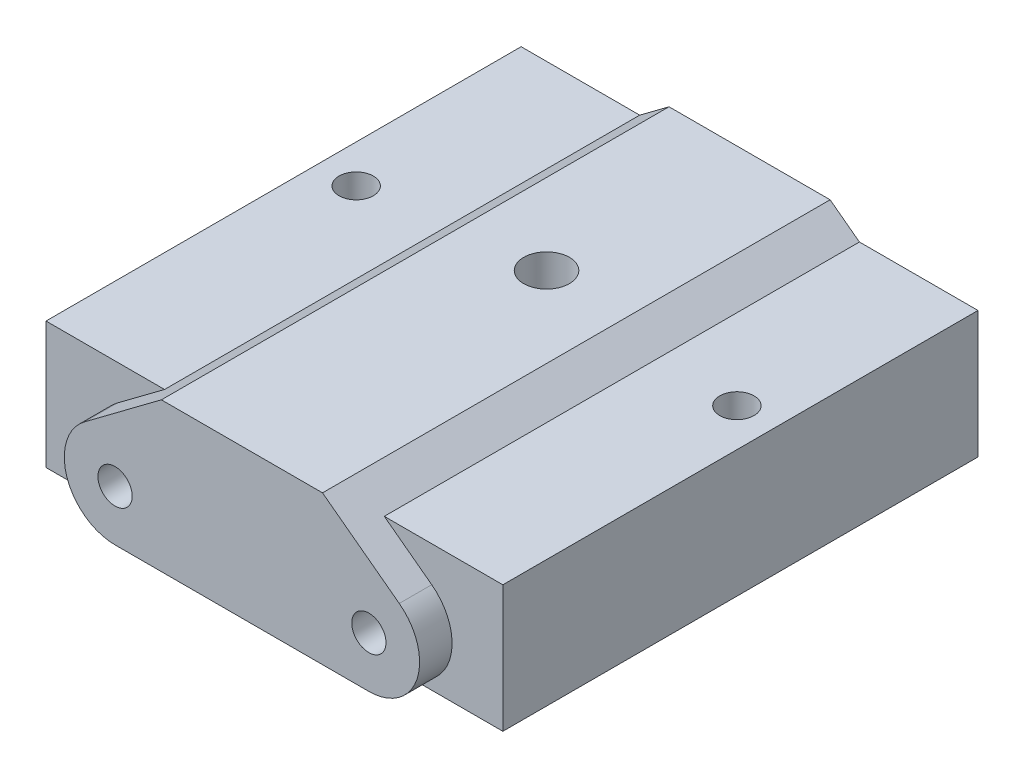
ISO-10303-21;
HEADER;
FILE_DESCRIPTION(('STEP AP214'),'2;1');
FILE_NAME('part.step','',(''),(''),'','','');
FILE_SCHEMA(('AUTOMOTIVE_DESIGN { 1 0 10303 214 1 1 1 1 }'));
ENDSEC;
DATA;
#1=APPLICATION_CONTEXT('core data for automotive mechanical design processes');
#2=APPLICATION_PROTOCOL_DEFINITION('international standard','automotive_design',2000,#1);
#3=PRODUCT_CONTEXT('',#1,'mechanical');
#4=PRODUCT('Part','Part','',(#3));
#5=PRODUCT_RELATED_PRODUCT_CATEGORY('part','',(#4));
#6=PRODUCT_DEFINITION_FORMATION('','',#4);
#7=PRODUCT_DEFINITION_CONTEXT('part definition',#1,'design');
#8=PRODUCT_DEFINITION('design','',#6,#7);
#9=PRODUCT_DEFINITION_SHAPE('','',#8);
#10=(LENGTH_UNIT() NAMED_UNIT(*) SI_UNIT(.MILLI.,.METRE.));
#11=(NAMED_UNIT(*) PLANE_ANGLE_UNIT() SI_UNIT($,.RADIAN.));
#12=(NAMED_UNIT(*) SI_UNIT($,.STERADIAN.) SOLID_ANGLE_UNIT());
#13=UNCERTAINTY_MEASURE_WITH_UNIT(LENGTH_MEASURE(1.E-05),#10,'distance_accuracy_value','');
#14=(GEOMETRIC_REPRESENTATION_CONTEXT(3) GLOBAL_UNCERTAINTY_ASSIGNED_CONTEXT((#13)) GLOBAL_UNIT_ASSIGNED_CONTEXT((#10,
#11,#12)) REPRESENTATION_CONTEXT('',''));
#15=CARTESIAN_POINT('',(0.,0.,0.));
#16=DIRECTION('',(0.,0.,1.));
#17=DIRECTION('',(1.,0.,0.));
#18=AXIS2_PLACEMENT_3D('',#15,#16,#17);
#19=CARTESIAN_POINT('',(-10.,6.,37.4416644150983));
#20=DIRECTION('',(0.,0.,1.));
#21=DIRECTION('',(1.,0.,0.));
#22=AXIS2_PLACEMENT_3D('',#19,#20,#21);
#23=PLANE('',#22);
#24=DIRECTION('',(-1.,0.,0.));
#25=VECTOR('',#24,1.);
#26=CARTESIAN_POINT('',(-18.,-4.,37.4416644150983));
#27=LINE('',#26,#25);
#28=CARTESIAN_POINT('',(18.,-4.,37.4416644150983));
#29=VERTEX_POINT('',#28);
#30=CARTESIAN_POINT('',(10.,-4.,37.4416644150983));
#31=VERTEX_POINT('',#30);
#32=EDGE_CURVE('E247',#29,#31,#27,.T.);
#33=ORIENTED_EDGE('',*,*,#32,.F.);
#34=DIRECTION('',(0.,-1.,0.));
#35=VECTOR('',#34,1.);
#36=CARTESIAN_POINT('',(18.,6.,37.4416644150983));
#37=LINE('',#36,#35);
#38=CARTESIAN_POINT('',(18.,6.,37.4416644150983));
#39=VERTEX_POINT('',#38);
#40=EDGE_CURVE('E151',#39,#29,#37,.T.);
#41=ORIENTED_EDGE('',*,*,#40,.F.);
#42=DIRECTION('',(-1.,0.,0.));
#43=VECTOR('',#42,1.);
#44=CARTESIAN_POINT('',(18.,6.,37.4416644150983));
#45=LINE('',#44,#43);
#46=CARTESIAN_POINT('',(8.65659447883979,6.,37.4416644150983));
#47=VERTEX_POINT('',#46);
#48=EDGE_CURVE('E231',#39,#47,#45,.T.);
#49=ORIENTED_EDGE('',*,*,#48,.T.);
#50=DIRECTION('',(-0.800775417645543,0.598964715567292,0.));
#51=VECTOR('',#50,1.);
#52=CARTESIAN_POINT('',(6.34773271878964,7.7269844914305,37.4416644150983));
#53=LINE('',#52,#51);
#54=CARTESIAN_POINT('',(12.3958588622692,3.20310167058217,37.4416644150983));
#55=VERTEX_POINT('',#54);
#56=EDGE_CURVE('E162',#55,#47,#53,.T.);
#57=ORIENTED_EDGE('',*,*,#56,.F.);
#58=CARTESIAN_POINT('',(10.,0.,37.4416644150983));
#59=DIRECTION('',(0.,0.,1.));
#60=DIRECTION('',(1.,0.,0.));
#61=AXIS2_PLACEMENT_3D('',#58,#59,#60);
#62=CIRCLE('',#61,4.);
#63=EDGE_CURVE('E58',#31,#55,#62,.T.);
#64=ORIENTED_EDGE('',*,*,#63,.F.);
#65=EDGE_LOOP('',(#33,#41,#49,#57,#64));
#66=FACE_BOUND('',#65,.T.);
#67=ADVANCED_FACE('F33',(#66),#23,.T.);
#68=CARTESIAN_POINT('',(0.,14.,16.));
#69=DIRECTION('',(0.,-1.,0.));
#70=DIRECTION('',(0.,0.,-1.));
#71=AXIS2_PLACEMENT_3D('',#68,#69,#70);
#72=CYLINDRICAL_SURFACE('',#71,1.8);
#73=CARTESIAN_POINT('',(0.,7.7269844914305,16.));
#74=DIRECTION('',(0.,-1.,0.));
#75=DIRECTION('',(0.,0.,-1.));
#76=AXIS2_PLACEMENT_3D('',#73,#74,#75);
#77=CIRCLE('',#76,1.8);
#78=CARTESIAN_POINT('',(0.,7.7269844914305,14.2));
#79=VERTEX_POINT('',#78);
#80=EDGE_CURVE('E227',#79,#79,#77,.T.);
#81=ORIENTED_EDGE('',*,*,#80,.F.);
#82=EDGE_LOOP('',(#81));
#83=FACE_BOUND('',#82,.T.);
#84=CARTESIAN_POINT('',(0.,0.999999999999999,16.));
#85=DIRECTION('',(0.,-1.,0.));
#86=DIRECTION('',(0.,0.,-1.));
#87=AXIS2_PLACEMENT_3D('',#84,#85,#86);
#88=CIRCLE('',#87,1.8);
#89=CARTESIAN_POINT('',(0.,0.999999999999999,14.2));
#90=VERTEX_POINT('',#89);
#91=EDGE_CURVE('E206',#90,#90,#88,.F.);
#92=ORIENTED_EDGE('',*,*,#91,.F.);
#93=EDGE_LOOP('',(#92));
#94=FACE_BOUND('',#93,.T.);
#95=ADVANCED_FACE('F276',(#83,#94),#72,.F.);
#96=CARTESIAN_POINT('',(-10.,0.,40.));
#97=DIRECTION('',(0.,0.,1.));
#98=DIRECTION('',(1.,0.,0.));
#99=AXIS2_PLACEMENT_3D('',#96,#97,#98);
#100=PLANE('',#99);
#101=CARTESIAN_POINT('',(10.,0.,40.));
#102=DIRECTION('',(0.,0.,1.));
#103=DIRECTION('',(1.,0.,0.));
#104=AXIS2_PLACEMENT_3D('',#101,#102,#103);
#105=CIRCLE('',#104,1.35);
#106=CARTESIAN_POINT('',(11.35,0.,40.));
#107=VERTEX_POINT('',#106);
#108=EDGE_CURVE('E171',#107,#107,#105,.T.);
#109=ORIENTED_EDGE('',*,*,#108,.F.);
#110=EDGE_LOOP('',(#109));
#111=FACE_BOUND('',#110,.T.);
#112=CARTESIAN_POINT('',(-10.,0.,40.));
#113=DIRECTION('',(0.,0.,1.));
#114=DIRECTION('',(1.,0.,0.));
#115=AXIS2_PLACEMENT_3D('',#112,#113,#114);
#116=CIRCLE('',#115,4.);
#117=CARTESIAN_POINT('',(-12.3958588622692,3.20310167058217,40.));
#118=VERTEX_POINT('',#117);
#119=CARTESIAN_POINT('',(-10.,-4.,40.));
#120=VERTEX_POINT('',#119);
#121=EDGE_CURVE('E175',#118,#120,#116,.T.);
#122=ORIENTED_EDGE('',*,*,#121,.T.);
#123=DIRECTION('',(1.,0.,0.));
#124=VECTOR('',#123,1.);
#125=CARTESIAN_POINT('',(-10.,-4.,40.));
#126=LINE('',#125,#124);
#127=CARTESIAN_POINT('',(10.,-4.,40.));
#128=VERTEX_POINT('',#127);
#129=EDGE_CURVE('E178',#120,#128,#126,.T.);
#130=ORIENTED_EDGE('',*,*,#129,.T.);
#131=CARTESIAN_POINT('',(10.,0.,40.));
#132=DIRECTION('',(0.,0.,1.));
#133=DIRECTION('',(1.,0.,0.));
#134=AXIS2_PLACEMENT_3D('',#131,#132,#133);
#135=CIRCLE('',#134,4.);
#136=CARTESIAN_POINT('',(12.3958588622692,3.20310167058217,40.));
#137=VERTEX_POINT('',#136);
#138=EDGE_CURVE('E181',#128,#137,#135,.T.);
#139=ORIENTED_EDGE('',*,*,#138,.T.);
#140=DIRECTION('',(-0.800775417645543,0.598964715567292,0.));
#141=VECTOR('',#140,1.);
#142=CARTESIAN_POINT('',(6.34773271878964,7.7269844914305,40.));
#143=LINE('',#142,#141);
#144=CARTESIAN_POINT('',(6.34773271878964,7.7269844914305,40.));
#145=VERTEX_POINT('',#144);
#146=EDGE_CURVE('E183',#137,#145,#143,.T.);
#147=ORIENTED_EDGE('',*,*,#146,.T.);
#148=DIRECTION('',(-1.,0.,0.));
#149=VECTOR('',#148,1.);
#150=CARTESIAN_POINT('',(0.,7.7269844914305,40.));
#151=LINE('',#150,#149);
#152=CARTESIAN_POINT('',(-6.34773271878964,7.7269844914305,40.));
#153=VERTEX_POINT('',#152);
#154=EDGE_CURVE('E185',#145,#153,#151,.T.);
#155=ORIENTED_EDGE('',*,*,#154,.T.);
#156=DIRECTION('',(-0.800775417645543,-0.598964715567291,0.));
#157=VECTOR('',#156,1.);
#158=CARTESIAN_POINT('',(-6.34773271878964,7.7269844914305,40.));
#159=LINE('',#158,#157);
#160=EDGE_CURVE('E187',#153,#118,#159,.T.);
#161=ORIENTED_EDGE('',*,*,#160,.T.);
#162=EDGE_LOOP('',(#122,#130,#139,#147,#155,#161));
#163=FACE_BOUND('',#162,.T.);
#164=CARTESIAN_POINT('',(-10.,0.,40.));
#165=DIRECTION('',(0.,0.,1.));
#166=DIRECTION('',(1.,0.,0.));
#167=AXIS2_PLACEMENT_3D('',#164,#165,#166);
#168=CIRCLE('',#167,1.35);
#169=CARTESIAN_POINT('',(-8.65,0.,40.));
#170=VERTEX_POINT('',#169);
#171=EDGE_CURVE('E168',#170,#170,#168,.T.);
#172=ORIENTED_EDGE('',*,*,#171,.F.);
#173=EDGE_LOOP('',(#172));
#174=FACE_BOUND('',#173,.T.);
#175=ADVANCED_FACE('F263',(#111,#163,#174),#100,.T.);
#176=CARTESIAN_POINT('',(-10.,0.,0.));
#177=DIRECTION('',(0.,0.,1.));
#178=DIRECTION('',(1.,0.,0.));
#179=AXIS2_PLACEMENT_3D('',#176,#177,#178);
#180=PLANE('',#179);
#181=CARTESIAN_POINT('',(10.,0.,0.));
#182=DIRECTION('',(0.,0.,-1.));
#183=DIRECTION('',(-1.,0.,0.));
#184=AXIS2_PLACEMENT_3D('',#181,#182,#183);
#185=CIRCLE('',#184,1.35);
#186=CARTESIAN_POINT('',(8.65,0.,0.));
#187=VERTEX_POINT('',#186);
#188=EDGE_CURVE('E359',#187,#187,#185,.T.);
#189=ORIENTED_EDGE('',*,*,#188,.F.);
#190=EDGE_LOOP('',(#189));
#191=FACE_BOUND('',#190,.T.);
#192=CARTESIAN_POINT('',(-10.,0.,0.));
#193=DIRECTION('',(0.,0.,-1.));
#194=DIRECTION('',(-1.,0.,0.));
#195=AXIS2_PLACEMENT_3D('',#192,#193,#194);
#196=CIRCLE('',#195,1.34);
#197=CARTESIAN_POINT('',(-11.34,0.,0.));
#198=VERTEX_POINT('',#197);
#199=EDGE_CURVE('E358',#198,#198,#196,.T.);
#200=ORIENTED_EDGE('',*,*,#199,.F.);
#201=EDGE_LOOP('',(#200));
#202=FACE_BOUND('',#201,.T.);
#203=DIRECTION('',(0.,-1.,0.));
#204=VECTOR('',#203,1.);
#205=CARTESIAN_POINT('',(18.,6.,0.));
#206=LINE('',#205,#204);
#207=CARTESIAN_POINT('',(18.,6.,0.));
#208=VERTEX_POINT('',#207);
#209=CARTESIAN_POINT('',(18.,-4.,0.));
#210=VERTEX_POINT('',#209);
#211=EDGE_CURVE('E142',#208,#210,#206,.T.);
#212=ORIENTED_EDGE('',*,*,#211,.T.);
#213=DIRECTION('',(1.,0.,0.));
#214=VECTOR('',#213,1.);
#215=CARTESIAN_POINT('',(18.,-4.,0.));
#216=LINE('',#215,#214);
#217=CARTESIAN_POINT('',(-18.,-4.,0.));
#218=VERTEX_POINT('',#217);
#219=EDGE_CURVE('E50',#218,#210,#216,.T.);
#220=ORIENTED_EDGE('',*,*,#219,.F.);
#221=DIRECTION('',(0.,-1.,0.));
#222=VECTOR('',#221,1.);
#223=CARTESIAN_POINT('',(-18.,6.,0.));
#224=LINE('',#223,#222);
#225=CARTESIAN_POINT('',(-18.,6.,0.));
#226=VERTEX_POINT('',#225);
#227=EDGE_CURVE('E139',#226,#218,#224,.T.);
#228=ORIENTED_EDGE('',*,*,#227,.F.);
#229=DIRECTION('',(1.,0.,0.));
#230=VECTOR('',#229,1.);
#231=CARTESIAN_POINT('',(-18.,6.,0.));
#232=LINE('',#231,#230);
#233=CARTESIAN_POINT('',(-8.65659447883979,6.,0.));
#234=VERTEX_POINT('',#233);
#235=EDGE_CURVE('E236',#226,#234,#232,.T.);
#236=ORIENTED_EDGE('',*,*,#235,.T.);
#237=DIRECTION('',(-0.800775417645543,-0.598964715567291,0.));
#238=VECTOR('',#237,1.);
#239=CARTESIAN_POINT('',(-6.34773271878964,7.7269844914305,0.));
#240=LINE('',#239,#238);
#241=CARTESIAN_POINT('',(-6.34773271878964,7.7269844914305,0.));
#242=VERTEX_POINT('',#241);
#243=EDGE_CURVE('E179',#242,#234,#240,.T.);
#244=ORIENTED_EDGE('',*,*,#243,.F.);
#245=DIRECTION('',(-1.,0.,0.));
#246=VECTOR('',#245,1.);
#247=CARTESIAN_POINT('',(0.,7.7269844914305,0.));
#248=LINE('',#247,#246);
#249=CARTESIAN_POINT('',(6.34773271878964,7.7269844914305,0.));
#250=VERTEX_POINT('',#249);
#251=EDGE_CURVE('E191',#250,#242,#248,.T.);
#252=ORIENTED_EDGE('',*,*,#251,.F.);
#253=DIRECTION('',(-0.800775417645543,0.598964715567292,0.));
#254=VECTOR('',#253,1.);
#255=CARTESIAN_POINT('',(6.34773271878964,7.7269844914305,0.));
#256=LINE('',#255,#254);
#257=CARTESIAN_POINT('',(8.65659447883979,6.,0.));
#258=VERTEX_POINT('',#257);
#259=EDGE_CURVE('E174',#258,#250,#256,.T.);
#260=ORIENTED_EDGE('',*,*,#259,.F.);
#261=EDGE_CURVE('E235',#258,#208,#232,.T.);
#262=ORIENTED_EDGE('',*,*,#261,.T.);
#263=EDGE_LOOP('',(#212,#220,#228,#236,#244,#252,#260,#262));
#264=FACE_BOUND('',#263,.T.);
#265=ADVANCED_FACE('F137',(#191,#202,#264),#180,.F.);
#266=CARTESIAN_POINT('',(-10.,0.,40.));
#267=DIRECTION('',(0.,0.,-1.));
#268=DIRECTION('',(-1.,0.,0.));
#269=AXIS2_PLACEMENT_3D('',#266,#267,#268);
#270=CYLINDRICAL_SURFACE('',#269,4.);
#271=DIRECTION('',(0.,0.,-1.));
#272=VECTOR('',#271,1.);
#273=CARTESIAN_POINT('',(-12.3958588622692,3.20310167058217,40.));
#274=LINE('',#273,#272);
#275=CARTESIAN_POINT('',(-12.3958588622692,3.20310167058217,37.4416644150983));
#276=VERTEX_POINT('',#275);
#277=EDGE_CURVE('E189',#118,#276,#274,.T.);
#278=ORIENTED_EDGE('',*,*,#277,.T.);
#279=CARTESIAN_POINT('',(-10.,0.,37.4416644150983));
#280=DIRECTION('',(0.,0.,1.));
#281=DIRECTION('',(1.,0.,0.));
#282=AXIS2_PLACEMENT_3D('',#279,#280,#281);
#283=CIRCLE('',#282,4.);
#284=CARTESIAN_POINT('',(-10.,-4.,37.4416644150983));
#285=VERTEX_POINT('',#284);
#286=EDGE_CURVE('E159',#276,#285,#283,.T.);
#287=ORIENTED_EDGE('',*,*,#286,.T.);
#288=DIRECTION('',(0.,0.,-1.));
#289=VECTOR('',#288,1.);
#290=CARTESIAN_POINT('',(-10.,-4.,40.));
#291=LINE('',#290,#289);
#292=EDGE_CURVE('E42',#120,#285,#291,.T.);
#293=ORIENTED_EDGE('',*,*,#292,.F.);
#294=ORIENTED_EDGE('',*,*,#121,.F.);
#295=EDGE_LOOP('',(#278,#287,#293,#294));
#296=FACE_BOUND('',#295,.T.);
#297=ADVANCED_FACE('F35',(#296),#270,.T.);
#298=CARTESIAN_POINT('',(-10.,-4.,40.));
#299=DIRECTION('',(0.,1.,0.));
#300=DIRECTION('',(0.,0.,1.));
#301=AXIS2_PLACEMENT_3D('',#298,#299,#300);
#302=PLANE('',#301);
#303=ORIENTED_EDGE('',*,*,#292,.T.);
#304=CARTESIAN_POINT('',(-18.,-4.,37.4416644150983));
#305=VERTEX_POINT('',#304);
#306=EDGE_CURVE('E128',#285,#305,#27,.T.);
#307=ORIENTED_EDGE('',*,*,#306,.T.);
#308=DIRECTION('',(0.,0.,-1.));
#309=VECTOR('',#308,1.);
#310=CARTESIAN_POINT('',(-18.,-4.,0.));
#311=LINE('',#310,#309);
#312=EDGE_CURVE('E124',#305,#218,#311,.T.);
#313=ORIENTED_EDGE('',*,*,#312,.T.);
#314=ORIENTED_EDGE('',*,*,#219,.T.);
#315=DIRECTION('',(0.,0.,1.));
#316=VECTOR('',#315,1.);
#317=CARTESIAN_POINT('',(18.,-4.,37.4416644150983));
#318=LINE('',#317,#316);
#319=EDGE_CURVE('E143',#210,#29,#318,.T.);
#320=ORIENTED_EDGE('',*,*,#319,.T.);
#321=ORIENTED_EDGE('',*,*,#32,.T.);
#322=DIRECTION('',(0.,0.,-1.));
#323=VECTOR('',#322,1.);
#324=CARTESIAN_POINT('',(10.,-4.,40.));
#325=LINE('',#324,#323);
#326=EDGE_CURVE('E204',#128,#31,#325,.T.);
#327=ORIENTED_EDGE('',*,*,#326,.F.);
#328=ORIENTED_EDGE('',*,*,#129,.F.);
#329=EDGE_LOOP('',(#303,#307,#313,#314,#320,#321,#327,#328));
#330=FACE_BOUND('',#329,.T.);
#331=CARTESIAN_POINT('',(0.,-4.,16.));
#332=DIRECTION('',(0.,1.,0.));
#333=DIRECTION('',(0.,0.,1.));
#334=AXIS2_PLACEMENT_3D('',#331,#332,#333);
#335=CIRCLE('',#334,11.);
#336=CARTESIAN_POINT('',(0.,-4.,27.));
#337=VERTEX_POINT('',#336);
#338=EDGE_CURVE('E216',#337,#337,#335,.T.);
#339=ORIENTED_EDGE('',*,*,#338,.T.);
#340=EDGE_LOOP('',(#339));
#341=FACE_BOUND('',#340,.T.);
#342=CARTESIAN_POINT('',(15.,-4.,16.));
#343=DIRECTION('',(0.,1.,0.));
#344=DIRECTION('',(0.,0.,1.));
#345=AXIS2_PLACEMENT_3D('',#342,#343,#344);
#346=CIRCLE('',#345,1.35);
#347=CARTESIAN_POINT('',(15.,-4.,17.35));
#348=VERTEX_POINT('',#347);
#349=EDGE_CURVE('E37',#348,#348,#346,.F.);
#350=ORIENTED_EDGE('',*,*,#349,.F.);
#351=EDGE_LOOP('',(#350));
#352=FACE_BOUND('',#351,.T.);
#353=CARTESIAN_POINT('',(-15.,-4.,16.));
#354=DIRECTION('',(0.,1.,0.));
#355=DIRECTION('',(0.,0.,1.));
#356=AXIS2_PLACEMENT_3D('',#353,#354,#355);
#357=CIRCLE('',#356,1.35);
#358=CARTESIAN_POINT('',(-15.,-4.,17.35));
#359=VERTEX_POINT('',#358);
#360=EDGE_CURVE('E221',#359,#359,#357,.F.);
#361=ORIENTED_EDGE('',*,*,#360,.F.);
#362=EDGE_LOOP('',(#361));
#363=FACE_BOUND('',#362,.T.);
#364=ADVANCED_FACE('F126',(#330,#341,#352,#363),#302,.F.);
#365=CARTESIAN_POINT('',(10.,0.,40.));
#366=DIRECTION('',(0.,0.,-1.));
#367=DIRECTION('',(-1.,0.,0.));
#368=AXIS2_PLACEMENT_3D('',#365,#366,#367);
#369=CYLINDRICAL_SURFACE('',#368,4.);
#370=ORIENTED_EDGE('',*,*,#326,.T.);
#371=ORIENTED_EDGE('',*,*,#63,.T.);
#372=DIRECTION('',(0.,0.,-1.));
#373=VECTOR('',#372,1.);
#374=CARTESIAN_POINT('',(12.3958588622692,3.20310167058217,40.));
#375=LINE('',#374,#373);
#376=EDGE_CURVE('E202',#137,#55,#375,.T.);
#377=ORIENTED_EDGE('',*,*,#376,.F.);
#378=ORIENTED_EDGE('',*,*,#138,.F.);
#379=EDGE_LOOP('',(#370,#371,#377,#378));
#380=FACE_BOUND('',#379,.T.);
#381=ADVANCED_FACE('F267',(#380),#369,.T.);
#382=CARTESIAN_POINT('',(6.34773271878964,7.7269844914305,40.));
#383=DIRECTION('',(-0.598964715567292,-0.800775417645543,0.));
#384=DIRECTION('',(0.800775417645543,-0.598964715567292,0.));
#385=AXIS2_PLACEMENT_3D('',#382,#383,#384);
#386=PLANE('',#385);
#387=ORIENTED_EDGE('',*,*,#376,.T.);
#388=ORIENTED_EDGE('',*,*,#56,.T.);
#389=DIRECTION('',(0.,0.,1.));
#390=VECTOR('',#389,1.);
#391=CARTESIAN_POINT('',(8.65659447883979,6.,40.));
#392=LINE('',#391,#390);
#393=EDGE_CURVE('E165',#258,#47,#392,.T.);
#394=ORIENTED_EDGE('',*,*,#393,.F.);
#395=ORIENTED_EDGE('',*,*,#259,.T.);
#396=DIRECTION('',(0.,0.,-1.));
#397=VECTOR('',#396,1.);
#398=CARTESIAN_POINT('',(6.34773271878964,7.7269844914305,40.));
#399=LINE('',#398,#397);
#400=EDGE_CURVE('E199',#145,#250,#399,.T.);
#401=ORIENTED_EDGE('',*,*,#400,.F.);
#402=ORIENTED_EDGE('',*,*,#146,.F.);
#403=EDGE_LOOP('',(#387,#388,#394,#395,#401,#402));
#404=FACE_BOUND('',#403,.T.);
#405=ADVANCED_FACE('F253',(#404),#386,.F.);
#406=CARTESIAN_POINT('',(0.,7.7269844914305,40.));
#407=DIRECTION('',(0.,-1.,0.));
#408=DIRECTION('',(0.,0.,-1.));
#409=AXIS2_PLACEMENT_3D('',#406,#407,#408);
#410=PLANE('',#409);
#411=ORIENTED_EDGE('',*,*,#80,.T.);
#412=EDGE_LOOP('',(#411));
#413=FACE_BOUND('',#412,.T.);
#414=ORIENTED_EDGE('',*,*,#251,.T.);
#415=DIRECTION('',(0.,0.,-1.));
#416=VECTOR('',#415,1.);
#417=CARTESIAN_POINT('',(-6.34773271878964,7.7269844914305,40.));
#418=LINE('',#417,#416);
#419=EDGE_CURVE('E196',#153,#242,#418,.T.);
#420=ORIENTED_EDGE('',*,*,#419,.F.);
#421=ORIENTED_EDGE('',*,*,#154,.F.);
#422=ORIENTED_EDGE('',*,*,#400,.T.);
#423=EDGE_LOOP('',(#414,#420,#421,#422));
#424=FACE_BOUND('',#423,.T.);
#425=ADVANCED_FACE('F260',(#413,#424),#410,.F.);
#426=CARTESIAN_POINT('',(-6.34773271878964,7.7269844914305,40.));
#427=DIRECTION('',(0.598964715567291,-0.800775417645543,0.));
#428=DIRECTION('',(0.800775417645543,0.598964715567291,0.));
#429=AXIS2_PLACEMENT_3D('',#426,#427,#428);
#430=PLANE('',#429);
#431=DIRECTION('',(0.,0.,-1.));
#432=VECTOR('',#431,1.);
#433=CARTESIAN_POINT('',(-8.65659447883979,6.,40.));
#434=LINE('',#433,#432);
#435=CARTESIAN_POINT('',(-8.65659447883979,6.,37.4416644150983));
#436=VERTEX_POINT('',#435);
#437=EDGE_CURVE('E11',#436,#234,#434,.T.);
#438=ORIENTED_EDGE('',*,*,#437,.F.);
#439=DIRECTION('',(-0.800775417645543,-0.598964715567291,0.));
#440=VECTOR('',#439,1.);
#441=CARTESIAN_POINT('',(-6.34773271878964,7.7269844914305,37.4416644150983));
#442=LINE('',#441,#440);
#443=EDGE_CURVE('E157',#436,#276,#442,.T.);
#444=ORIENTED_EDGE('',*,*,#443,.T.);
#445=ORIENTED_EDGE('',*,*,#277,.F.);
#446=ORIENTED_EDGE('',*,*,#160,.F.);
#447=ORIENTED_EDGE('',*,*,#419,.T.);
#448=ORIENTED_EDGE('',*,*,#243,.T.);
#449=EDGE_LOOP('',(#438,#444,#445,#446,#447,#448));
#450=FACE_BOUND('',#449,.T.);
#451=ADVANCED_FACE('F306',(#450),#430,.F.);
#452=CARTESIAN_POINT('',(10.,0.,40.));
#453=DIRECTION('',(0.,0.,-1.));
#454=DIRECTION('',(-1.,0.,0.));
#455=AXIS2_PLACEMENT_3D('',#452,#453,#454);
#456=CYLINDRICAL_SURFACE('',#455,1.35);
#457=ORIENTED_EDGE('',*,*,#108,.T.);
#458=EDGE_LOOP('',(#457));
#459=FACE_BOUND('',#458,.T.);
#460=CARTESIAN_POINT('',(10.,0.,25.4416644150983));
#461=DIRECTION('',(0.,0.,1.));
#462=DIRECTION('',(1.,0.,0.));
#463=AXIS2_PLACEMENT_3D('',#460,#461,#462);
#464=CIRCLE('',#463,1.35);
#465=CARTESIAN_POINT('',(11.35,0.,25.4416644150983));
#466=VERTEX_POINT('',#465);
#467=EDGE_CURVE('E133',#466,#466,#464,.T.);
#468=ORIENTED_EDGE('',*,*,#467,.F.);
#469=EDGE_LOOP('',(#468));
#470=FACE_BOUND('',#469,.T.);
#471=ADVANCED_FACE('F386',(#459,#470),#456,.F.);
#472=CARTESIAN_POINT('',(-10.,0.,40.));
#473=DIRECTION('',(0.,0.,-1.));
#474=DIRECTION('',(-1.,0.,0.));
#475=AXIS2_PLACEMENT_3D('',#472,#473,#474);
#476=CYLINDRICAL_SURFACE('',#475,1.35);
#477=ORIENTED_EDGE('',*,*,#171,.T.);
#478=EDGE_LOOP('',(#477));
#479=FACE_BOUND('',#478,.T.);
#480=CARTESIAN_POINT('',(-10.,0.,25.4416644150983));
#481=DIRECTION('',(0.,0.,1.));
#482=DIRECTION('',(1.,0.,0.));
#483=AXIS2_PLACEMENT_3D('',#480,#481,#482);
#484=CIRCLE('',#483,1.35);
#485=CARTESIAN_POINT('',(-8.65,0.,25.4416644150983));
#486=VERTEX_POINT('',#485);
#487=EDGE_CURVE('E368',#486,#486,#484,.T.);
#488=ORIENTED_EDGE('',*,*,#487,.F.);
#489=EDGE_LOOP('',(#488));
#490=FACE_BOUND('',#489,.T.);
#491=ADVANCED_FACE('F314',(#479,#490),#476,.F.);
#492=CARTESIAN_POINT('',(-18.,6.,37.4416644150983));
#493=DIRECTION('',(-1.,0.,0.));
#494=DIRECTION('',(0.,0.,1.));
#495=AXIS2_PLACEMENT_3D('',#492,#493,#494);
#496=PLANE('',#495);
#497=ORIENTED_EDGE('',*,*,#312,.F.);
#498=DIRECTION('',(0.,-1.,0.));
#499=VECTOR('',#498,1.);
#500=CARTESIAN_POINT('',(-18.,6.,37.4416644150983));
#501=LINE('',#500,#499);
#502=CARTESIAN_POINT('',(-18.,6.,37.4416644150983));
#503=VERTEX_POINT('',#502);
#504=EDGE_CURVE('E149',#503,#305,#501,.T.);
#505=ORIENTED_EDGE('',*,*,#504,.F.);
#506=DIRECTION('',(0.,0.,-1.));
#507=VECTOR('',#506,1.);
#508=CARTESIAN_POINT('',(-18.,6.,37.4416644150983));
#509=LINE('',#508,#507);
#510=EDGE_CURVE('E148',#503,#226,#509,.T.);
#511=ORIENTED_EDGE('',*,*,#510,.T.);
#512=ORIENTED_EDGE('',*,*,#227,.T.);
#513=EDGE_LOOP('',(#497,#505,#511,#512));
#514=FACE_BOUND('',#513,.T.);
#515=ADVANCED_FACE('F146',(#514),#496,.T.);
#516=CARTESIAN_POINT('',(0.,6.,0.));
#517=DIRECTION('',(0.,-1.,0.));
#518=DIRECTION('',(0.,0.,-1.));
#519=AXIS2_PLACEMENT_3D('',#516,#517,#518);
#520=PLANE('',#519);
#521=CARTESIAN_POINT('',(-15.,6.,16.));
#522=DIRECTION('',(0.,-1.,0.));
#523=DIRECTION('',(0.,0.,-1.));
#524=AXIS2_PLACEMENT_3D('',#521,#522,#523);
#525=CIRCLE('',#524,1.35);
#526=CARTESIAN_POINT('',(-15.,6.,14.65));
#527=VERTEX_POINT('',#526);
#528=EDGE_CURVE('E213',#527,#527,#525,.T.);
#529=ORIENTED_EDGE('',*,*,#528,.T.);
#530=EDGE_LOOP('',(#529));
#531=FACE_BOUND('',#530,.T.);
#532=EDGE_CURVE('E230',#436,#503,#45,.T.);
#533=ORIENTED_EDGE('',*,*,#532,.F.);
#534=ORIENTED_EDGE('',*,*,#437,.T.);
#535=ORIENTED_EDGE('',*,*,#235,.F.);
#536=ORIENTED_EDGE('',*,*,#510,.F.);
#537=EDGE_LOOP('',(#533,#534,#535,#536));
#538=FACE_BOUND('',#537,.T.);
#539=ADVANCED_FACE('F294',(#531,#538),#520,.F.);
#540=CARTESIAN_POINT('',(15.,6.,16.));
#541=DIRECTION('',(0.,-1.,0.));
#542=DIRECTION('',(0.,0.,-1.));
#543=AXIS2_PLACEMENT_3D('',#540,#541,#542);
#544=CIRCLE('',#543,1.35);
#545=CARTESIAN_POINT('',(15.,6.,14.65));
#546=VERTEX_POINT('',#545);
#547=EDGE_CURVE('E208',#546,#546,#544,.T.);
#548=ORIENTED_EDGE('',*,*,#547,.T.);
#549=EDGE_LOOP('',(#548));
#550=FACE_BOUND('',#549,.T.);
#551=ORIENTED_EDGE('',*,*,#261,.F.);
#552=ORIENTED_EDGE('',*,*,#393,.T.);
#553=ORIENTED_EDGE('',*,*,#48,.F.);
#554=DIRECTION('',(0.,0.,1.));
#555=VECTOR('',#554,1.);
#556=CARTESIAN_POINT('',(18.,6.,0.));
#557=LINE('',#556,#555);
#558=EDGE_CURVE('E153',#208,#39,#557,.T.);
#559=ORIENTED_EDGE('',*,*,#558,.F.);
#560=EDGE_LOOP('',(#551,#552,#553,#559));
#561=FACE_BOUND('',#560,.T.);
#562=ADVANCED_FACE('F250',(#550,#561),#520,.F.);
#563=ORIENTED_EDGE('',*,*,#306,.F.);
#564=ORIENTED_EDGE('',*,*,#286,.F.);
#565=ORIENTED_EDGE('',*,*,#443,.F.);
#566=ORIENTED_EDGE('',*,*,#532,.T.);
#567=ORIENTED_EDGE('',*,*,#504,.T.);
#568=EDGE_LOOP('',(#563,#564,#565,#566,#567));
#569=FACE_BOUND('',#568,.T.);
#570=ADVANCED_FACE('F278',(#569),#23,.T.);
#571=CARTESIAN_POINT('',(18.,6.,0.));
#572=DIRECTION('',(1.,0.,0.));
#573=DIRECTION('',(0.,0.,-1.));
#574=AXIS2_PLACEMENT_3D('',#571,#572,#573);
#575=PLANE('',#574);
#576=ORIENTED_EDGE('',*,*,#319,.F.);
#577=ORIENTED_EDGE('',*,*,#211,.F.);
#578=ORIENTED_EDGE('',*,*,#558,.T.);
#579=ORIENTED_EDGE('',*,*,#40,.T.);
#580=EDGE_LOOP('',(#576,#577,#578,#579));
#581=FACE_BOUND('',#580,.T.);
#582=ADVANCED_FACE('F241',(#581),#575,.T.);
#583=CARTESIAN_POINT('',(0.,-9.,16.));
#584=DIRECTION('',(0.,1.,0.));
#585=DIRECTION('',(0.,0.,1.));
#586=AXIS2_PLACEMENT_3D('',#583,#584,#585);
#587=CYLINDRICAL_SURFACE('',#586,11.);
#588=ORIENTED_EDGE('',*,*,#338,.F.);
#589=EDGE_LOOP('',(#588));
#590=FACE_BOUND('',#589,.T.);
#591=CARTESIAN_POINT('',(0.,0.999999999999999,16.));
#592=DIRECTION('',(0.,-1.,0.));
#593=DIRECTION('',(0.,0.,-1.));
#594=AXIS2_PLACEMENT_3D('',#591,#592,#593);
#595=CIRCLE('',#594,11.);
#596=CARTESIAN_POINT('',(0.,0.999999999999999,5.));
#597=VERTEX_POINT('',#596);
#598=EDGE_CURVE('E209',#597,#597,#595,.T.);
#599=ORIENTED_EDGE('',*,*,#598,.F.);
#600=EDGE_LOOP('',(#599));
#601=FACE_BOUND('',#600,.T.);
#602=ADVANCED_FACE('F292',(#590,#601),#587,.F.);
#603=CARTESIAN_POINT('',(-15.,9.,16.));
#604=DIRECTION('',(0.,-1.,0.));
#605=DIRECTION('',(0.,0.,-1.));
#606=AXIS2_PLACEMENT_3D('',#603,#604,#605);
#607=CYLINDRICAL_SURFACE('',#606,1.35);
#608=ORIENTED_EDGE('',*,*,#360,.T.);
#609=EDGE_LOOP('',(#608));
#610=FACE_BOUND('',#609,.T.);
#611=ORIENTED_EDGE('',*,*,#528,.F.);
#612=EDGE_LOOP('',(#611));
#613=FACE_BOUND('',#612,.T.);
#614=ADVANCED_FACE('F317',(#610,#613),#607,.F.);
#615=CARTESIAN_POINT('',(15.,9.,16.));
#616=DIRECTION('',(0.,-1.,0.));
#617=DIRECTION('',(0.,0.,-1.));
#618=AXIS2_PLACEMENT_3D('',#615,#616,#617);
#619=CYLINDRICAL_SURFACE('',#618,1.35);
#620=ORIENTED_EDGE('',*,*,#349,.T.);
#621=EDGE_LOOP('',(#620));
#622=FACE_BOUND('',#621,.T.);
#623=ORIENTED_EDGE('',*,*,#547,.F.);
#624=EDGE_LOOP('',(#623));
#625=FACE_BOUND('',#624,.T.);
#626=ADVANCED_FACE('F322',(#622,#625),#619,.F.);
#627=CARTESIAN_POINT('',(0.,0.999999999999999,16.));
#628=DIRECTION('',(0.,-1.,0.));
#629=DIRECTION('',(0.,0.,-1.));
#630=AXIS2_PLACEMENT_3D('',#627,#628,#629);
#631=PLANE('',#630);
#632=ORIENTED_EDGE('',*,*,#598,.T.);
#633=EDGE_LOOP('',(#632));
#634=FACE_BOUND('',#633,.T.);
#635=ORIENTED_EDGE('',*,*,#91,.T.);
#636=EDGE_LOOP('',(#635));
#637=FACE_BOUND('',#636,.T.);
#638=ADVANCED_FACE('F326',(#634,#637),#631,.T.);
#639=CARTESIAN_POINT('',(10.,0.,25.4416644150983));
#640=DIRECTION('',(0.,0.,1.));
#641=DIRECTION('',(1.,0.,0.));
#642=AXIS2_PLACEMENT_3D('',#639,#640,#641);
#643=PLANE('',#642);
#644=ORIENTED_EDGE('',*,*,#467,.T.);
#645=EDGE_LOOP('',(#644));
#646=FACE_BOUND('',#645,.T.);
#647=ADVANCED_FACE('F330',(#646),#643,.T.);
#648=CARTESIAN_POINT('',(-10.,0.,25.4416644150983));
#649=DIRECTION('',(0.,0.,1.));
#650=DIRECTION('',(1.,0.,0.));
#651=AXIS2_PLACEMENT_3D('',#648,#649,#650);
#652=PLANE('',#651);
#653=ORIENTED_EDGE('',*,*,#487,.T.);
#654=EDGE_LOOP('',(#653));
#655=FACE_BOUND('',#654,.T.);
#656=ADVANCED_FACE('F333',(#655),#652,.T.);
#657=CARTESIAN_POINT('',(-10.,0.,8.));
#658=DIRECTION('',(0.,0.,-1.));
#659=DIRECTION('',(-1.,0.,0.));
#660=AXIS2_PLACEMENT_3D('',#657,#658,#659);
#661=CYLINDRICAL_SURFACE('',#660,1.34);
#662=CARTESIAN_POINT('',(-10.,0.,8.));
#663=DIRECTION('',(0.,0.,-1.));
#664=DIRECTION('',(-1.,0.,0.));
#665=AXIS2_PLACEMENT_3D('',#662,#663,#664);
#666=CIRCLE('',#665,1.34);
#667=CARTESIAN_POINT('',(-11.34,0.,8.));
#668=VERTEX_POINT('',#667);
#669=EDGE_CURVE('E362',#668,#668,#666,.T.);
#670=ORIENTED_EDGE('',*,*,#669,.F.);
#671=EDGE_LOOP('',(#670));
#672=FACE_BOUND('',#671,.T.);
#673=ORIENTED_EDGE('',*,*,#199,.T.);
#674=EDGE_LOOP('',(#673));
#675=FACE_BOUND('',#674,.T.);
#676=ADVANCED_FACE('F337',(#672,#675),#661,.F.);
#677=CARTESIAN_POINT('',(-10.,0.,8.));
#678=DIRECTION('',(0.,0.,-1.));
#679=DIRECTION('',(-1.,0.,0.));
#680=AXIS2_PLACEMENT_3D('',#677,#678,#679);
#681=PLANE('',#680);
#682=ORIENTED_EDGE('',*,*,#669,.T.);
#683=EDGE_LOOP('',(#682));
#684=FACE_BOUND('',#683,.T.);
#685=ADVANCED_FACE('F341',(#684),#681,.T.);
#686=CARTESIAN_POINT('',(10.,0.,8.));
#687=DIRECTION('',(0.,0.,-1.));
#688=DIRECTION('',(-1.,0.,0.));
#689=AXIS2_PLACEMENT_3D('',#686,#687,#688);
#690=CYLINDRICAL_SURFACE('',#689,1.35);
#691=CARTESIAN_POINT('',(10.,0.,8.));
#692=DIRECTION('',(0.,0.,-1.));
#693=DIRECTION('',(-1.,0.,0.));
#694=AXIS2_PLACEMENT_3D('',#691,#692,#693);
#695=CIRCLE('',#694,1.35);
#696=CARTESIAN_POINT('',(8.65,0.,8.));
#697=VERTEX_POINT('',#696);
#698=EDGE_CURVE('E357',#697,#697,#695,.T.);
#699=ORIENTED_EDGE('',*,*,#698,.F.);
#700=EDGE_LOOP('',(#699));
#701=FACE_BOUND('',#700,.T.);
#702=ORIENTED_EDGE('',*,*,#188,.T.);
#703=EDGE_LOOP('',(#702));
#704=FACE_BOUND('',#703,.T.);
#705=ADVANCED_FACE('F345',(#701,#704),#690,.F.);
#706=CARTESIAN_POINT('',(10.,0.,8.));
#707=DIRECTION('',(0.,0.,-1.));
#708=DIRECTION('',(-1.,0.,0.));
#709=AXIS2_PLACEMENT_3D('',#706,#707,#708);
#710=PLANE('',#709);
#711=ORIENTED_EDGE('',*,*,#698,.T.);
#712=EDGE_LOOP('',(#711));
#713=FACE_BOUND('',#712,.T.);
#714=ADVANCED_FACE('F349',(#713),#710,.T.);
#715=CLOSED_SHELL('',(#67,#95,#175,#265,#297,#364,#381,#405,#425,#451,#471,#491,#515,#539,#562,
#570,#582,#602,#614,#626,#638,#647,#656,#676,#685,#705,#714));
#716=MANIFOLD_SOLID_BREP('B2',#715);
#717=ADVANCED_BREP_SHAPE_REPRESENTATION('',(#18,#716),#14);
#718=SHAPE_DEFINITION_REPRESENTATION(#9,#717);
ENDSEC;
END-ISO-10303-21;
